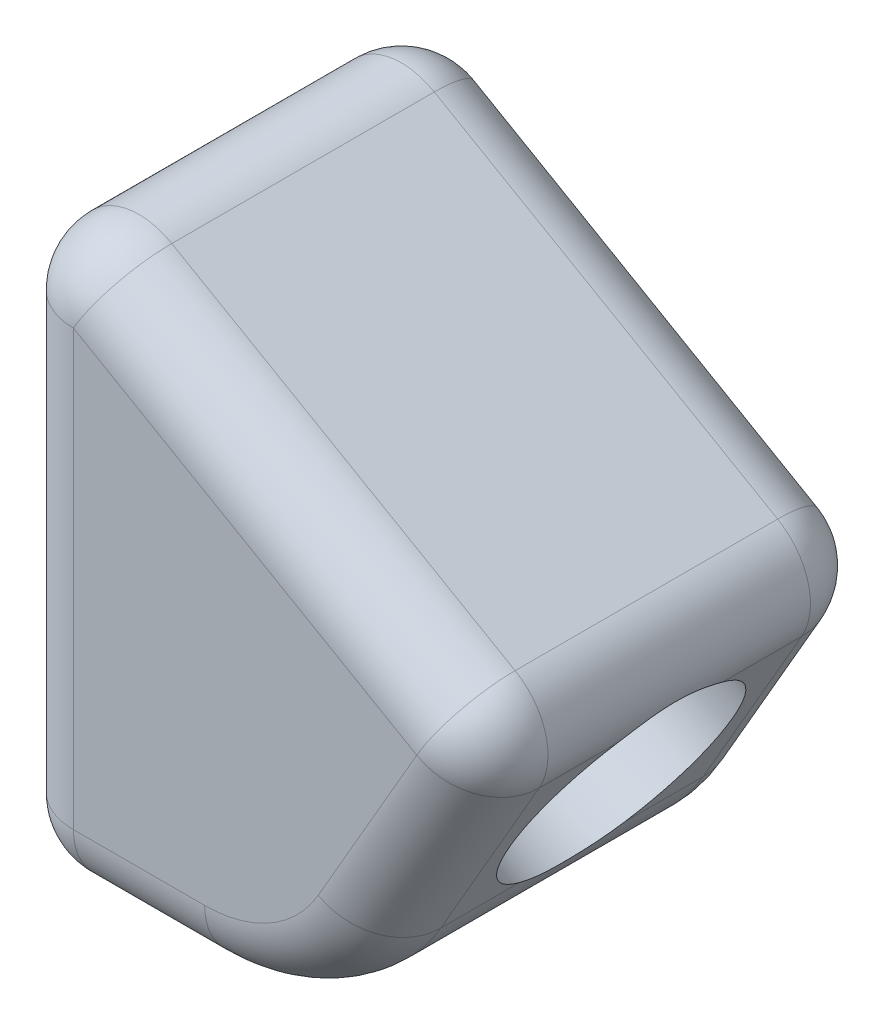
ISO-10303-21;
HEADER;
FILE_DESCRIPTION(('STEP AP214'),'2;1');
FILE_NAME('part.step','',(''),(''),'','','');
FILE_SCHEMA(('AUTOMOTIVE_DESIGN { 1 0 10303 214 1 1 1 1 }'));
ENDSEC;
DATA;
#1=APPLICATION_CONTEXT('core data for automotive mechanical design processes');
#2=APPLICATION_PROTOCOL_DEFINITION('international standard','automotive_design',2000,#1);
#3=PRODUCT_CONTEXT('',#1,'mechanical');
#4=PRODUCT('Part','Part','',(#3));
#5=PRODUCT_RELATED_PRODUCT_CATEGORY('part','',(#4));
#6=PRODUCT_DEFINITION_FORMATION('','',#4);
#7=PRODUCT_DEFINITION_CONTEXT('part definition',#1,'design');
#8=PRODUCT_DEFINITION('design','',#6,#7);
#9=PRODUCT_DEFINITION_SHAPE('','',#8);
#10=(LENGTH_UNIT() NAMED_UNIT(*) SI_UNIT(.MILLI.,.METRE.));
#11=(NAMED_UNIT(*) PLANE_ANGLE_UNIT() SI_UNIT($,.RADIAN.));
#12=(NAMED_UNIT(*) SI_UNIT($,.STERADIAN.) SOLID_ANGLE_UNIT());
#13=UNCERTAINTY_MEASURE_WITH_UNIT(LENGTH_MEASURE(1.E-05),#10,'distance_accuracy_value','');
#14=(GEOMETRIC_REPRESENTATION_CONTEXT(3) GLOBAL_UNCERTAINTY_ASSIGNED_CONTEXT((#13)) GLOBAL_UNIT_ASSIGNED_CONTEXT((#10,
#11,#12)) REPRESENTATION_CONTEXT('',''));
#15=CARTESIAN_POINT('',(0.,0.,0.));
#16=DIRECTION('',(0.,0.,1.));
#17=DIRECTION('',(1.,0.,0.));
#18=AXIS2_PLACEMENT_3D('',#15,#16,#17);
#19=CARTESIAN_POINT('',(0.,97.,2.));
#20=DIRECTION('',(0.,-1.,0.));
#21=DIRECTION('',(0.,0.,-1.));
#22=AXIS2_PLACEMENT_3D('',#19,#20,#21);
#23=PLANE('',#22);
#24=CARTESIAN_POINT('',(1.,97.,0.));
#25=DIRECTION('',(0.,-1.,0.));
#26=DIRECTION('',(0.,0.,-1.));
#27=AXIS2_PLACEMENT_3D('',#24,#25,#26);
#28=CIRCLE('',#27,1.2);
#29=CARTESIAN_POINT('',(2.,97.,0.66332495807108));
#30=VERTEX_POINT('',#29);
#31=CARTESIAN_POINT('',(0.,97.,0.663324958071079));
#32=VERTEX_POINT('',#31);
#33=EDGE_CURVE('E179',#30,#32,#28,.T.);
#34=ORIENTED_EDGE('',*,*,#33,.F.);
#35=DIRECTION('',(0.,0.,1.));
#36=VECTOR('',#35,1.);
#37=CARTESIAN_POINT('',(2.,97.,-3.));
#38=LINE('',#37,#36);
#39=CARTESIAN_POINT('',(2.,97.,2.));
#40=VERTEX_POINT('',#39);
#41=EDGE_CURVE('E41',#30,#40,#38,.T.);
#42=ORIENTED_EDGE('',*,*,#41,.T.);
#43=DIRECTION('',(1.,0.,0.));
#44=VECTOR('',#43,1.);
#45=CARTESIAN_POINT('',(-0.999999999999999,97.,2.));
#46=LINE('',#45,#44);
#47=CARTESIAN_POINT('',(0.,97.,2.));
#48=VERTEX_POINT('',#47);
#49=EDGE_CURVE('E253',#40,#48,#46,.F.);
#50=ORIENTED_EDGE('',*,*,#49,.T.);
#51=DIRECTION('',(0.,0.,1.));
#52=VECTOR('',#51,1.);
#53=CARTESIAN_POINT('',(0.,97.,-3.));
#54=LINE('',#53,#52);
#55=EDGE_CURVE('E255',#48,#32,#54,.F.);
#56=ORIENTED_EDGE('',*,*,#55,.T.);
#57=EDGE_LOOP('',(#34,#42,#50,#56));
#58=FACE_BOUND('',#57,.T.);
#59=ADVANCED_FACE('F37',(#58),#23,.T.);
#60=CARTESIAN_POINT('',(6.09807621135332,101.098076211353,0.));
#61=DIRECTION('',(0.86602540378444,-0.499999999999997,0.));
#62=DIRECTION('',(0.499999999999997,0.86602540378444,0.));
#63=AXIS2_PLACEMENT_3D('',#60,#61,#62);
#64=PLANE('',#63);
#65=CARTESIAN_POINT('',(5.3480762113533,99.7990381056767,0.));
#66=DIRECTION('',(0.86602540378444,-0.499999999999997,0.));
#67=DIRECTION('',(0.499999999999997,0.86602540378444,0.));
#68=AXIS2_PLACEMENT_3D('',#65,#66,#67);
#69=CIRCLE('',#68,1.7);
#70=CARTESIAN_POINT('',(6.09807621135328,101.098076211353,0.800000000000058));
#71=VERTEX_POINT('',#70);
#72=CARTESIAN_POINT('',(4.59807621135332,98.5,0.799999999999932));
#73=VERTEX_POINT('',#72);
#74=EDGE_CURVE('E364',#71,#73,#69,.T.);
#75=ORIENTED_EDGE('',*,*,#74,.F.);
#76=DIRECTION('',(0.,0.,1.));
#77=VECTOR('',#76,1.);
#78=CARTESIAN_POINT('',(6.09807621135332,101.098076211353,-3.));
#79=LINE('',#78,#77);
#80=CARTESIAN_POINT('',(6.09807621135332,101.098076211353,2.));
#81=VERTEX_POINT('',#80);
#82=EDGE_CURVE('E238',#71,#81,#79,.T.);
#83=ORIENTED_EDGE('',*,*,#82,.T.);
#84=DIRECTION('',(0.499999999999997,0.86602540378444,0.));
#85=VECTOR('',#84,1.);
#86=CARTESIAN_POINT('',(4.59807621135332,98.5,2.));
#87=LINE('',#86,#85);
#88=CARTESIAN_POINT('',(4.59807621135332,98.5,2.));
#89=VERTEX_POINT('',#88);
#90=EDGE_CURVE('E229',#81,#89,#87,.F.);
#91=ORIENTED_EDGE('',*,*,#90,.T.);
#92=DIRECTION('',(0.,0.,1.));
#93=VECTOR('',#92,1.);
#94=CARTESIAN_POINT('',(4.59807621135332,98.5,-3.));
#95=LINE('',#94,#93);
#96=EDGE_CURVE('E219',#73,#89,#95,.T.);
#97=ORIENTED_EDGE('',*,*,#96,.F.);
#98=EDGE_LOOP('',(#75,#83,#91,#97));
#99=FACE_BOUND('',#98,.T.);
#100=ADVANCED_FACE('F496',(#99),#64,.T.);
#101=CARTESIAN_POINT('',(0.,97.,-0.663324958071079));
#102=VERTEX_POINT('',#101);
#103=CARTESIAN_POINT('',(2.,97.,-0.66332495807108));
#104=VERTEX_POINT('',#103);
#105=EDGE_CURVE('E55',#102,#104,#28,.T.);
#106=ORIENTED_EDGE('',*,*,#105,.F.);
#107=CARTESIAN_POINT('',(0.,97.,-2.));
#108=VERTEX_POINT('',#107);
#109=EDGE_CURVE('E258',#102,#108,#54,.F.);
#110=ORIENTED_EDGE('',*,*,#109,.T.);
#111=DIRECTION('',(1.,0.,0.));
#112=VECTOR('',#111,1.);
#113=CARTESIAN_POINT('',(0.,97.,-2.));
#114=LINE('',#113,#112);
#115=CARTESIAN_POINT('',(2.,97.,-2.));
#116=VERTEX_POINT('',#115);
#117=EDGE_CURVE('E259',#108,#116,#114,.T.);
#118=ORIENTED_EDGE('',*,*,#117,.T.);
#119=EDGE_CURVE('E195',#116,#104,#38,.T.);
#120=ORIENTED_EDGE('',*,*,#119,.T.);
#121=EDGE_LOOP('',(#106,#110,#118,#120));
#122=FACE_BOUND('',#121,.T.);
#123=ADVANCED_FACE('F388',(#122),#23,.T.);
#124=CARTESIAN_POINT('',(4.59807621135328,98.5,-0.799999999999932));
#125=VERTEX_POINT('',#124);
#126=CARTESIAN_POINT('',(6.09807621135328,101.098076211353,-0.800000000000058));
#127=VERTEX_POINT('',#126);
#128=EDGE_CURVE('E361',#125,#127,#69,.T.);
#129=ORIENTED_EDGE('',*,*,#128,.F.);
#130=CARTESIAN_POINT('',(4.59807621135332,98.5,-2.));
#131=VERTEX_POINT('',#130);
#132=EDGE_CURVE('E226',#131,#125,#95,.T.);
#133=ORIENTED_EDGE('',*,*,#132,.F.);
#134=DIRECTION('',(0.499999999999997,0.86602540378444,0.));
#135=VECTOR('',#134,1.);
#136=CARTESIAN_POINT('',(6.09807621135332,101.098076211353,-2.));
#137=LINE('',#136,#135);
#138=CARTESIAN_POINT('',(6.09807621135332,101.098076211353,-2.));
#139=VERTEX_POINT('',#138);
#140=EDGE_CURVE('E239',#131,#139,#137,.T.);
#141=ORIENTED_EDGE('',*,*,#140,.T.);
#142=EDGE_CURVE('E235',#139,#127,#79,.T.);
#143=ORIENTED_EDGE('',*,*,#142,.T.);
#144=EDGE_LOOP('',(#129,#133,#141,#143));
#145=FACE_BOUND('',#144,.T.);
#146=ADVANCED_FACE('F39',(#145),#64,.T.);
#147=CARTESIAN_POINT('',(0.,104.618802153517,2.));
#148=DIRECTION('',(0.,0.,1.));
#149=DIRECTION('',(1.,0.,0.));
#150=AXIS2_PLACEMENT_3D('',#147,#148,#149);
#151=SPHERICAL_SURFACE('',#150,1.);
#152=CARTESIAN_POINT('',(0.,104.618802153517,2.));
#153=DIRECTION('',(0.,0.,1.));
#154=DIRECTION('',(1.,0.,0.));
#155=AXIS2_PLACEMENT_3D('',#152,#153,#154);
#156=CIRCLE('',#155,1.);
#157=CARTESIAN_POINT('',(-0.999999999999999,104.618802153517,2.));
#158=VERTEX_POINT('',#157);
#159=CARTESIAN_POINT('',(0.500000000000004,105.484827557301,2.));
#160=VERTEX_POINT('',#159);
#161=EDGE_CURVE('E337',#158,#160,#156,.F.);
#162=ORIENTED_EDGE('',*,*,#161,.F.);
#163=CARTESIAN_POINT('',(0.,104.618802153517,2.));
#164=DIRECTION('',(0.,1.,0.));
#165=DIRECTION('',(0.,0.,1.));
#166=AXIS2_PLACEMENT_3D('',#163,#164,#165);
#167=CIRCLE('',#166,1.);
#168=CARTESIAN_POINT('',(0.,104.618802153517,3.));
#169=VERTEX_POINT('',#168);
#170=EDGE_CURVE('E349',#158,#169,#167,.T.);
#171=ORIENTED_EDGE('',*,*,#170,.T.);
#172=CARTESIAN_POINT('',(0.,104.618802153517,2.));
#173=DIRECTION('',(-0.866025403784439,0.5,0.));
#174=DIRECTION('',(-0.5,-0.866025403784439,0.));
#175=AXIS2_PLACEMENT_3D('',#172,#173,#174);
#176=CIRCLE('',#175,1.);
#177=EDGE_CURVE('E340',#160,#169,#176,.F.);
#178=ORIENTED_EDGE('',*,*,#177,.F.);
#179=EDGE_LOOP('',(#162,#171,#178));
#180=FACE_BOUND('',#179,.T.);
#181=ADVANCED_FACE('F520',(#180),#151,.T.);
#182=CARTESIAN_POINT('',(0.,104.618802153517,-2.));
#183=DIRECTION('',(0.,0.,1.));
#184=DIRECTION('',(1.,0.,0.));
#185=AXIS2_PLACEMENT_3D('',#182,#183,#184);
#186=SPHERICAL_SURFACE('',#185,1.);
#187=CARTESIAN_POINT('',(0.,104.618802153517,-2.));
#188=DIRECTION('',(0.,1.,0.));
#189=DIRECTION('',(0.,0.,1.));
#190=AXIS2_PLACEMENT_3D('',#187,#188,#189);
#191=CIRCLE('',#190,1.);
#192=CARTESIAN_POINT('',(0.,104.618802153517,-3.));
#193=VERTEX_POINT('',#192);
#194=CARTESIAN_POINT('',(-0.999999999999999,104.618802153517,-2.));
#195=VERTEX_POINT('',#194);
#196=EDGE_CURVE('E320',#193,#195,#191,.T.);
#197=ORIENTED_EDGE('',*,*,#196,.T.);
#198=CARTESIAN_POINT('',(0.,104.618802153517,-2.));
#199=DIRECTION('',(0.,0.,-1.));
#200=DIRECTION('',(-1.,0.,0.));
#201=AXIS2_PLACEMENT_3D('',#198,#199,#200);
#202=CIRCLE('',#201,1.);
#203=CARTESIAN_POINT('',(0.500000000000004,105.484827557301,-2.));
#204=VERTEX_POINT('',#203);
#205=EDGE_CURVE('E323',#195,#204,#202,.T.);
#206=ORIENTED_EDGE('',*,*,#205,.T.);
#207=CARTESIAN_POINT('',(0.,104.618802153517,-2.));
#208=DIRECTION('',(-0.866025403784439,0.499999999999999,0.));
#209=DIRECTION('',(-0.499999999999999,-0.866025403784439,0.));
#210=AXIS2_PLACEMENT_3D('',#207,#208,#209);
#211=CIRCLE('',#210,1.);
#212=EDGE_CURVE('E312',#193,#204,#211,.F.);
#213=ORIENTED_EDGE('',*,*,#212,.F.);
#214=EDGE_LOOP('',(#197,#206,#213));
#215=FACE_BOUND('',#214,.T.);
#216=ADVANCED_FACE('F458',(#215),#186,.T.);
#217=CARTESIAN_POINT('',(0.,104.618802153517,-3.));
#218=DIRECTION('',(0.,0.,1.));
#219=DIRECTION('',(1.,0.,0.));
#220=AXIS2_PLACEMENT_3D('',#217,#218,#219);
#221=CYLINDRICAL_SURFACE('',#220,1.);
#222=ORIENTED_EDGE('',*,*,#161,.T.);
#223=DIRECTION('',(0.,0.,1.));
#224=VECTOR('',#223,1.);
#225=CARTESIAN_POINT('',(0.500000000000004,105.484827557301,-3.));
#226=LINE('',#225,#224);
#227=EDGE_CURVE('E270',#204,#160,#226,.T.);
#228=ORIENTED_EDGE('',*,*,#227,.F.);
#229=ORIENTED_EDGE('',*,*,#205,.F.);
#230=DIRECTION('',(0.,0.,1.));
#231=VECTOR('',#230,1.);
#232=CARTESIAN_POINT('',(-0.999999999999999,104.618802153517,-3.));
#233=LINE('',#232,#231);
#234=EDGE_CURVE('E281',#158,#195,#233,.F.);
#235=ORIENTED_EDGE('',*,*,#234,.F.);
#236=EDGE_LOOP('',(#222,#228,#229,#235));
#237=FACE_BOUND('',#236,.T.);
#238=ADVANCED_FACE('F456',(#237),#221,.T.);
#239=CARTESIAN_POINT('',(0.,100.,2.));
#240=DIRECTION('',(0.,1.,0.));
#241=DIRECTION('',(0.,0.,1.));
#242=AXIS2_PLACEMENT_3D('',#239,#240,#241);
#243=CYLINDRICAL_SURFACE('',#242,1.);
#244=CARTESIAN_POINT('',(0.,98.,2.));
#245=DIRECTION('',(0.,-1.,0.));
#246=DIRECTION('',(0.,0.,-1.));
#247=AXIS2_PLACEMENT_3D('',#244,#245,#246);
#248=CIRCLE('',#247,1.);
#249=CARTESIAN_POINT('',(0.,98.,3.));
#250=VERTEX_POINT('',#249);
#251=CARTESIAN_POINT('',(-0.999999999999999,98.,2.));
#252=VERTEX_POINT('',#251);
#253=EDGE_CURVE('E358',#250,#252,#248,.T.);
#254=ORIENTED_EDGE('',*,*,#253,.F.);
#255=DIRECTION('',(0.,-1.,0.));
#256=VECTOR('',#255,1.);
#257=CARTESIAN_POINT('',(0.,97.,3.));
#258=LINE('',#257,#256);
#259=EDGE_CURVE('E292',#169,#250,#258,.T.);
#260=ORIENTED_EDGE('',*,*,#259,.F.);
#261=ORIENTED_EDGE('',*,*,#170,.F.);
#262=DIRECTION('',(0.,-1.,0.));
#263=VECTOR('',#262,1.);
#264=CARTESIAN_POINT('',(-0.999999999999999,106.350852961086,2.));
#265=LINE('',#264,#263);
#266=EDGE_CURVE('E277',#252,#158,#265,.F.);
#267=ORIENTED_EDGE('',*,*,#266,.F.);
#268=EDGE_LOOP('',(#254,#260,#261,#267));
#269=FACE_BOUND('',#268,.T.);
#270=ADVANCED_FACE('F517',(#269),#243,.T.);
#271=CARTESIAN_POINT('',(0.,97.,-2.));
#272=DIRECTION('',(0.,-1.,0.));
#273=DIRECTION('',(0.,0.,-1.));
#274=AXIS2_PLACEMENT_3D('',#271,#272,#273);
#275=CYLINDRICAL_SURFACE('',#274,1.);
#276=CARTESIAN_POINT('',(0.,98.,-2.));
#277=DIRECTION('',(0.,-1.,0.));
#278=DIRECTION('',(0.,0.,-1.));
#279=AXIS2_PLACEMENT_3D('',#276,#277,#278);
#280=CIRCLE('',#279,1.);
#281=CARTESIAN_POINT('',(-0.999999999999999,98.,-2.));
#282=VERTEX_POINT('',#281);
#283=CARTESIAN_POINT('',(0.,98.,-3.));
#284=VERTEX_POINT('',#283);
#285=EDGE_CURVE('E334',#282,#284,#280,.T.);
#286=ORIENTED_EDGE('',*,*,#285,.F.);
#287=DIRECTION('',(0.,-1.,0.));
#288=VECTOR('',#287,1.);
#289=CARTESIAN_POINT('',(-0.999999999999999,97.,-2.));
#290=LINE('',#289,#288);
#291=EDGE_CURVE('E283',#195,#282,#290,.T.);
#292=ORIENTED_EDGE('',*,*,#291,.F.);
#293=ORIENTED_EDGE('',*,*,#196,.F.);
#294=DIRECTION('',(0.,-1.,0.));
#295=VECTOR('',#294,1.);
#296=CARTESIAN_POINT('',(0.,100.,-3.));
#297=LINE('',#296,#295);
#298=EDGE_CURVE('E242',#284,#193,#297,.F.);
#299=ORIENTED_EDGE('',*,*,#298,.F.);
#300=EDGE_LOOP('',(#286,#292,#293,#299));
#301=FACE_BOUND('',#300,.T.);
#302=ADVANCED_FACE('F451',(#301),#275,.T.);
#303=CARTESIAN_POINT('',(3.50000000000001,102.598076211353,2.));
#304=DIRECTION('',(0.866025403784438,-0.500000000000001,0.));
#305=DIRECTION('',(0.500000000000001,0.866025403784438,0.));
#306=AXIS2_PLACEMENT_3D('',#303,#304,#305);
#307=CYLINDRICAL_SURFACE('',#306,1.);
#308=ORIENTED_EDGE('',*,*,#177,.T.);
#309=DIRECTION('',(-0.866025403784438,0.500000000000001,0.));
#310=VECTOR('',#309,1.);
#311=CARTESIAN_POINT('',(-1.5,105.484827557301,3.));
#312=LINE('',#311,#310);
#313=CARTESIAN_POINT('',(5.23205080756888,101.598076211353,3.));
#314=VERTEX_POINT('',#313);
#315=EDGE_CURVE('E290',#314,#169,#312,.T.);
#316=ORIENTED_EDGE('',*,*,#315,.F.);
#317=CARTESIAN_POINT('',(5.23205080756888,101.598076211353,2.));
#318=DIRECTION('',(0.86602540378444,-0.499999999999999,0.));
#319=DIRECTION('',(0.499999999999999,0.866025403784439,0.));
#320=AXIS2_PLACEMENT_3D('',#317,#318,#319);
#321=CIRCLE('',#320,1.);
#322=CARTESIAN_POINT('',(5.73205080756888,102.464101615138,2.));
#323=VERTEX_POINT('',#322);
#324=EDGE_CURVE('E326',#323,#314,#321,.T.);
#325=ORIENTED_EDGE('',*,*,#324,.F.);
#326=DIRECTION('',(-0.866025403784438,0.500000000000001,0.));
#327=VECTOR('',#326,1.);
#328=CARTESIAN_POINT('',(6.59807621135332,101.964101615138,2.));
#329=LINE('',#328,#327);
#330=EDGE_CURVE('E268',#160,#323,#329,.F.);
#331=ORIENTED_EDGE('',*,*,#330,.F.);
#332=EDGE_LOOP('',(#308,#316,#325,#331));
#333=FACE_BOUND('',#332,.T.);
#334=ADVANCED_FACE('F510',(#333),#307,.T.);
#335=CARTESIAN_POINT('',(6.09807621135332,101.098076211353,-2.));
#336=DIRECTION('',(-0.866025403784438,0.500000000000001,0.));
#337=DIRECTION('',(-0.500000000000001,-0.866025403784438,0.));
#338=AXIS2_PLACEMENT_3D('',#335,#336,#337);
#339=CYLINDRICAL_SURFACE('',#338,1.);
#340=ORIENTED_EDGE('',*,*,#212,.T.);
#341=DIRECTION('',(-0.866025403784438,0.500000000000001,0.));
#342=VECTOR('',#341,1.);
#343=CARTESIAN_POINT('',(6.59807621135332,101.964101615138,-2.));
#344=LINE('',#343,#342);
#345=CARTESIAN_POINT('',(5.73205080756888,102.464101615138,-2.));
#346=VERTEX_POINT('',#345);
#347=EDGE_CURVE('E274',#346,#204,#344,.T.);
#348=ORIENTED_EDGE('',*,*,#347,.F.);
#349=CARTESIAN_POINT('',(5.23205080756888,101.598076211353,-2.));
#350=DIRECTION('',(0.866025403784438,-0.500000000000002,0.));
#351=DIRECTION('',(0.500000000000002,0.866025403784438,0.));
#352=AXIS2_PLACEMENT_3D('',#349,#350,#351);
#353=CIRCLE('',#352,1.);
#354=CARTESIAN_POINT('',(5.23205080756888,101.598076211353,-3.));
#355=VERTEX_POINT('',#354);
#356=EDGE_CURVE('E303',#355,#346,#353,.T.);
#357=ORIENTED_EDGE('',*,*,#356,.F.);
#358=DIRECTION('',(-0.866025403784438,0.500000000000001,0.));
#359=VECTOR('',#358,1.);
#360=CARTESIAN_POINT('',(3.50000000000001,102.598076211353,-3.));
#361=LINE('',#360,#359);
#362=EDGE_CURVE('E244',#193,#355,#361,.F.);
#363=ORIENTED_EDGE('',*,*,#362,.F.);
#364=EDGE_LOOP('',(#340,#348,#357,#363));
#365=FACE_BOUND('',#364,.T.);
#366=ADVANCED_FACE('F463',(#365),#339,.T.);
#367=CARTESIAN_POINT('',(2.,100.,3.));
#368=DIRECTION('',(0.,0.,-1.));
#369=DIRECTION('',(-1.,0.,0.));
#370=AXIS2_PLACEMENT_3D('',#367,#368,#369);
#371=PLANE('',#370);
#372=ORIENTED_EDGE('',*,*,#259,.T.);
#373=DIRECTION('',(1.,0.,0.));
#374=VECTOR('',#373,1.);
#375=CARTESIAN_POINT('',(2.,98.,3.));
#376=LINE('',#375,#374);
#377=CARTESIAN_POINT('',(2.,98.,3.));
#378=VERTEX_POINT('',#377);
#379=EDGE_CURVE('E294',#250,#378,#376,.T.);
#380=ORIENTED_EDGE('',*,*,#379,.T.);
#381=CARTESIAN_POINT('',(2.,100.,3.));
#382=DIRECTION('',(0.,0.,-1.));
#383=DIRECTION('',(-1.,0.,0.));
#384=AXIS2_PLACEMENT_3D('',#381,#382,#383);
#385=CIRCLE('',#384,2.);
#386=CARTESIAN_POINT('',(3.73205080756888,99.,3.));
#387=VERTEX_POINT('',#386);
#388=EDGE_CURVE('E286',#378,#387,#385,.F.);
#389=ORIENTED_EDGE('',*,*,#388,.T.);
#390=DIRECTION('',(0.499999999999997,0.86602540378444,0.));
#391=VECTOR('',#390,1.);
#392=CARTESIAN_POINT('',(5.73205080756888,102.464101615138,3.));
#393=LINE('',#392,#391);
#394=EDGE_CURVE('E288',#387,#314,#393,.T.);
#395=ORIENTED_EDGE('',*,*,#394,.T.);
#396=ORIENTED_EDGE('',*,*,#315,.T.);
#397=EDGE_LOOP('',(#372,#380,#389,#395,#396));
#398=FACE_BOUND('',#397,.T.);
#399=ADVANCED_FACE('F514',(#398),#371,.F.);
#400=CARTESIAN_POINT('',(5.23205080756888,101.598076211353,2.));
#401=DIRECTION('',(0.,0.,1.));
#402=DIRECTION('',(1.,0.,0.));
#403=AXIS2_PLACEMENT_3D('',#400,#401,#402);
#404=SPHERICAL_SURFACE('',#403,1.);
#405=ORIENTED_EDGE('',*,*,#324,.T.);
#406=CARTESIAN_POINT('',(5.23205080756888,101.598076211353,2.));
#407=DIRECTION('',(0.5,0.866025403784439,0.));
#408=DIRECTION('',(-0.866025403784439,0.5,0.));
#409=AXIS2_PLACEMENT_3D('',#406,#407,#408);
#410=CIRCLE('',#409,1.);
#411=EDGE_CURVE('E329',#314,#81,#410,.T.);
#412=ORIENTED_EDGE('',*,*,#411,.T.);
#413=CARTESIAN_POINT('',(5.23205080756888,101.598076211353,2.));
#414=DIRECTION('',(0.,0.,1.));
#415=DIRECTION('',(1.,0.,0.));
#416=AXIS2_PLACEMENT_3D('',#413,#414,#415);
#417=CIRCLE('',#416,1.);
#418=EDGE_CURVE('E314',#323,#81,#417,.F.);
#419=ORIENTED_EDGE('',*,*,#418,.F.);
#420=EDGE_LOOP('',(#405,#412,#419));
#421=FACE_BOUND('',#420,.T.);
#422=ADVANCED_FACE('F505',(#421),#404,.T.);
#423=CARTESIAN_POINT('',(6.59807621135332,101.964101615138,-3.));
#424=DIRECTION('',(0.500000000000001,0.866025403784438,0.));
#425=DIRECTION('',(-0.866025403784438,0.500000000000001,0.));
#426=AXIS2_PLACEMENT_3D('',#423,#424,#425);
#427=PLANE('',#426);
#428=DIRECTION('',(0.,0.,1.));
#429=VECTOR('',#428,1.);
#430=CARTESIAN_POINT('',(5.73205080756888,102.464101615138,-3.));
#431=LINE('',#430,#429);
#432=EDGE_CURVE('E272',#323,#346,#431,.F.);
#433=ORIENTED_EDGE('',*,*,#432,.T.);
#434=ORIENTED_EDGE('',*,*,#347,.T.);
#435=ORIENTED_EDGE('',*,*,#227,.T.);
#436=ORIENTED_EDGE('',*,*,#330,.T.);
#437=EDGE_LOOP('',(#433,#434,#435,#436));
#438=FACE_BOUND('',#437,.T.);
#439=ADVANCED_FACE('F210',(#438),#427,.T.);
#440=CARTESIAN_POINT('',(5.23205080756888,101.598076211353,-2.));
#441=DIRECTION('',(0.,0.,1.));
#442=DIRECTION('',(1.,0.,0.));
#443=AXIS2_PLACEMENT_3D('',#440,#441,#442);
#444=SPHERICAL_SURFACE('',#443,1.);
#445=ORIENTED_EDGE('',*,*,#356,.T.);
#446=CARTESIAN_POINT('',(5.23205080756888,101.598076211353,-2.));
#447=DIRECTION('',(0.,0.,-1.));
#448=DIRECTION('',(-1.,0.,0.));
#449=AXIS2_PLACEMENT_3D('',#446,#447,#448);
#450=CIRCLE('',#449,1.);
#451=EDGE_CURVE('E306',#346,#139,#450,.T.);
#452=ORIENTED_EDGE('',*,*,#451,.T.);
#453=CARTESIAN_POINT('',(5.23205080756888,101.598076211353,-2.));
#454=DIRECTION('',(0.5,0.866025403784439,0.));
#455=DIRECTION('',(-0.866025403784439,0.5,0.));
#456=AXIS2_PLACEMENT_3D('',#453,#454,#455);
#457=CIRCLE('',#456,1.);
#458=EDGE_CURVE('E298',#355,#139,#457,.F.);
#459=ORIENTED_EDGE('',*,*,#458,.F.);
#460=EDGE_LOOP('',(#445,#452,#459));
#461=FACE_BOUND('',#460,.T.);
#462=ADVANCED_FACE('F659',(#461),#444,.T.);
#463=CARTESIAN_POINT('',(2.,100.,-3.));
#464=DIRECTION('',(0.,0.,-1.));
#465=DIRECTION('',(-1.,0.,0.));
#466=AXIS2_PLACEMENT_3D('',#463,#464,#465);
#467=PLANE('',#466);
#468=DIRECTION('',(0.499999999999997,0.86602540378444,0.));
#469=VECTOR('',#468,1.);
#470=CARTESIAN_POINT('',(3.73205080756888,99.,-3.));
#471=LINE('',#470,#469);
#472=CARTESIAN_POINT('',(3.73205080756888,99.,-3.));
#473=VERTEX_POINT('',#472);
#474=EDGE_CURVE('E248',#355,#473,#471,.F.);
#475=ORIENTED_EDGE('',*,*,#474,.T.);
#476=CARTESIAN_POINT('',(2.,100.,-3.));
#477=DIRECTION('',(0.,0.,-1.));
#478=DIRECTION('',(-1.,0.,0.));
#479=AXIS2_PLACEMENT_3D('',#476,#477,#478);
#480=CIRCLE('',#479,2.);
#481=CARTESIAN_POINT('',(2.,98.,-3.));
#482=VERTEX_POINT('',#481);
#483=EDGE_CURVE('E251',#473,#482,#480,.T.);
#484=ORIENTED_EDGE('',*,*,#483,.T.);
#485=DIRECTION('',(1.,0.,0.));
#486=VECTOR('',#485,1.);
#487=CARTESIAN_POINT('',(2.,98.,-3.));
#488=LINE('',#487,#486);
#489=EDGE_CURVE('E246',#482,#284,#488,.F.);
#490=ORIENTED_EDGE('',*,*,#489,.T.);
#491=ORIENTED_EDGE('',*,*,#298,.T.);
#492=ORIENTED_EDGE('',*,*,#362,.T.);
#493=EDGE_LOOP('',(#475,#484,#490,#491,#492));
#494=FACE_BOUND('',#493,.T.);
#495=ADVANCED_FACE('F466',(#494),#467,.T.);
#496=CARTESIAN_POINT('',(2.,100.,-2.));
#497=DIRECTION('',(0.,0.,-1.));
#498=DIRECTION('',(-1.,0.,0.));
#499=AXIS2_PLACEMENT_3D('',#496,#497,#498);
#500=TOROIDAL_SURFACE('',#499,2.,1.);
#501=CARTESIAN_POINT('',(2.,98.,-2.));
#502=DIRECTION('',(1.,0.,0.));
#503=DIRECTION('',(0.,0.,-1.));
#504=AXIS2_PLACEMENT_3D('',#501,#502,#503);
#505=CIRCLE('',#504,1.);
#506=EDGE_CURVE('E309',#116,#482,#505,.T.);
#507=ORIENTED_EDGE('',*,*,#506,.T.);
#508=ORIENTED_EDGE('',*,*,#483,.F.);
#509=CARTESIAN_POINT('',(3.73205080756888,99.,-2.));
#510=DIRECTION('',(0.5,0.866025403784438,0.));
#511=DIRECTION('',(-0.866025403784438,0.5,0.));
#512=AXIS2_PLACEMENT_3D('',#509,#510,#511);
#513=CIRCLE('',#512,1.);
#514=EDGE_CURVE('E301',#131,#473,#513,.T.);
#515=ORIENTED_EDGE('',*,*,#514,.F.);
#516=CARTESIAN_POINT('',(2.,100.,-2.));
#517=DIRECTION('',(0.,0.,-1.));
#518=DIRECTION('',(-1.,0.,0.));
#519=AXIS2_PLACEMENT_3D('',#516,#517,#518);
#520=CIRCLE('',#519,3.);
#521=EDGE_CURVE('E265',#116,#131,#520,.F.);
#522=ORIENTED_EDGE('',*,*,#521,.F.);
#523=EDGE_LOOP('',(#507,#508,#515,#522));
#524=FACE_BOUND('',#523,.T.);
#525=ADVANCED_FACE('F481',(#524),#500,.T.);
#526=CARTESIAN_POINT('',(5.23205080756888,101.598076211353,-2.));
#527=DIRECTION('',(0.499999999999997,0.86602540378444,0.));
#528=DIRECTION('',(-0.86602540378444,0.499999999999997,0.));
#529=AXIS2_PLACEMENT_3D('',#526,#527,#528);
#530=CYLINDRICAL_SURFACE('',#529,1.);
#531=ORIENTED_EDGE('',*,*,#514,.T.);
#532=ORIENTED_EDGE('',*,*,#474,.F.);
#533=ORIENTED_EDGE('',*,*,#458,.T.);
#534=ORIENTED_EDGE('',*,*,#140,.F.);
#535=EDGE_LOOP('',(#531,#532,#533,#534));
#536=FACE_BOUND('',#535,.T.);
#537=ADVANCED_FACE('F208',(#536),#530,.T.);
#538=CARTESIAN_POINT('',(5.23205080756888,101.598076211353,-3.));
#539=DIRECTION('',(0.,0.,1.));
#540=DIRECTION('',(1.,0.,0.));
#541=AXIS2_PLACEMENT_3D('',#538,#539,#540);
#542=CYLINDRICAL_SURFACE('',#541,1.);
#543=CARTESIAN_POINT('',(6.09807621135332,101.098076211353,-0.800000000000055));
#544=CARTESIAN_POINT('',(6.10803078805828,101.115338683814,-0.762643212308241));
#545=CARTESIAN_POINT('',(6.1167845318648,101.131671693267,-0.72454782677543));
#546=CARTESIAN_POINT('',(6.13221586045606,101.162185681627,-0.647106874380023));
#547=CARTESIAN_POINT('',(6.13889402379648,101.176367259668,-0.607761659276473));
#548=CARTESIAN_POINT('',(6.15050078384016,101.20228607231,-0.528055153701777));
#549=CARTESIAN_POINT('',(6.15543061377418,101.214025027453,-0.487694601031757));
#550=CARTESIAN_POINT('',(6.16381690807346,101.234843202211,-0.406138383714845));
#551=CARTESIAN_POINT('',(6.1672731911047,101.243922094439,-0.364942616939947));
#552=CARTESIAN_POINT('',(6.17326846488547,101.260150950659,-0.276951640930825));
#553=CARTESIAN_POINT('',(6.17564747898442,101.266938398907,-0.230078039616492));
#554=CARTESIAN_POINT('',(6.17903679483942,101.276759265848,-0.135868874319984));
#555=CARTESIAN_POINT('',(6.18004647398402,101.279790976823,-0.088533110046155));
#556=CARTESIAN_POINT('',(6.18078934368853,101.282011885316,0.00625314012193648));
#557=CARTESIAN_POINT('',(6.18052215968274,101.28119995531,0.0537036555977651));
#558=CARTESIAN_POINT('',(6.17868537465104,101.275754879999,0.148338284457708));
#559=CARTESIAN_POINT('',(6.17711632187487,101.271123343232,0.195522501566904));
#560=CARTESIAN_POINT('',(6.17245110603144,101.257931825397,0.291008479956032));
#561=CARTESIAN_POINT('',(6.16930171190307,101.249235689207,0.339288854787462));
#562=CARTESIAN_POINT('',(6.16116944878587,101.228122798393,0.434872197645592));
#563=CARTESIAN_POINT('',(6.15618649567663,101.215705873071,0.482175120723376));
#564=CARTESIAN_POINT('',(6.14398776754598,101.187453963733,0.575558229013717));
#565=CARTESIAN_POINT('',(6.13676768745757,101.171612407372,0.621635869074494));
#566=CARTESIAN_POINT('',(6.11959604660907,101.136961004659,0.712141519615453));
#567=CARTESIAN_POINT('',(6.10964410961385,101.118150749606,0.75656930191744));
#568=CARTESIAN_POINT('',(6.09807621135332,101.098076211353,0.800000000000056));
#569=B_SPLINE_CURVE_WITH_KNOTS('',3,(#543,#544,#545,#546,#547,#548,#549,#550,#551,#552,#553,
#554,#555,#556,#557,#558,#559,#560,#561,#562,#563,#564,#565,#566,#567,#568),.UNSPECIFIED.,.F.,
.F.,(4,2,2,2,2,2,2,2,2,2,2,2,4),(0.,0.126971192502358,0.253906960733841,0.380753012716916,
0.507614669815478,0.649709245593381,0.791868407528076,0.934069274175821,1.07621028683188,
1.22349738921128,1.37079124970245,1.51837033767408,1.66596976064836),.UNSPECIFIED.);
#570=EDGE_CURVE('E297',#127,#71,#569,.T.);
#571=ORIENTED_EDGE('',*,*,#570,.F.);
#572=ORIENTED_EDGE('',*,*,#142,.F.);
#573=ORIENTED_EDGE('',*,*,#451,.F.);
#574=ORIENTED_EDGE('',*,*,#432,.F.);
#575=ORIENTED_EDGE('',*,*,#418,.T.);
#576=ORIENTED_EDGE('',*,*,#82,.F.);
#577=EDGE_LOOP('',(#571,#572,#573,#574,#575,#576));
#578=FACE_BOUND('',#577,.T.);
#579=ADVANCED_FACE('F379',(#578),#542,.T.);
#580=CARTESIAN_POINT('',(0.,98.,-2.));
#581=DIRECTION('',(0.,0.,1.));
#582=DIRECTION('',(1.,0.,0.));
#583=AXIS2_PLACEMENT_3D('',#580,#581,#582);
#584=SPHERICAL_SURFACE('',#583,1.);
#585=CARTESIAN_POINT('',(0.,98.,-2.));
#586=DIRECTION('',(0.,0.,-1.));
#587=DIRECTION('',(-1.,0.,0.));
#588=AXIS2_PLACEMENT_3D('',#585,#586,#587);
#589=CIRCLE('',#588,1.);
#590=EDGE_CURVE('E332',#108,#282,#589,.T.);
#591=ORIENTED_EDGE('',*,*,#590,.T.);
#592=ORIENTED_EDGE('',*,*,#285,.T.);
#593=CARTESIAN_POINT('',(0.,98.,-2.));
#594=DIRECTION('',(-1.,0.,0.));
#595=DIRECTION('',(0.,0.,1.));
#596=AXIS2_PLACEMENT_3D('',#593,#594,#595);
#597=CIRCLE('',#596,1.);
#598=EDGE_CURVE('E317',#108,#284,#597,.F.);
#599=ORIENTED_EDGE('',*,*,#598,.F.);
#600=EDGE_LOOP('',(#591,#592,#599));
#601=FACE_BOUND('',#600,.T.);
#602=ADVANCED_FACE('F469',(#601),#584,.T.);
#603=CARTESIAN_POINT('',(0.,98.,-2.));
#604=DIRECTION('',(1.,0.,0.));
#605=DIRECTION('',(0.,0.,-1.));
#606=AXIS2_PLACEMENT_3D('',#603,#604,#605);
#607=CYLINDRICAL_SURFACE('',#606,1.);
#608=ORIENTED_EDGE('',*,*,#598,.T.);
#609=ORIENTED_EDGE('',*,*,#489,.F.);
#610=ORIENTED_EDGE('',*,*,#506,.F.);
#611=ORIENTED_EDGE('',*,*,#117,.F.);
#612=EDGE_LOOP('',(#608,#609,#610,#611));
#613=FACE_BOUND('',#612,.T.);
#614=ADVANCED_FACE('F472',(#613),#607,.T.);
#615=CARTESIAN_POINT('',(2.,100.,2.));
#616=DIRECTION('',(0.,0.,-1.));
#617=DIRECTION('',(-1.,0.,0.));
#618=AXIS2_PLACEMENT_3D('',#615,#616,#617);
#619=TOROIDAL_SURFACE('',#618,2.,1.);
#620=CARTESIAN_POINT('',(2.,98.,2.));
#621=DIRECTION('',(1.,0.,0.));
#622=DIRECTION('',(0.,0.,-1.));
#623=AXIS2_PLACEMENT_3D('',#620,#621,#622);
#624=CIRCLE('',#623,1.);
#625=EDGE_CURVE('E352',#378,#40,#624,.T.);
#626=ORIENTED_EDGE('',*,*,#625,.T.);
#627=CARTESIAN_POINT('',(2.,100.,2.));
#628=DIRECTION('',(0.,0.,-1.));
#629=DIRECTION('',(-1.,0.,0.));
#630=AXIS2_PLACEMENT_3D('',#627,#628,#629);
#631=CIRCLE('',#630,3.);
#632=EDGE_CURVE('E262',#89,#40,#631,.T.);
#633=ORIENTED_EDGE('',*,*,#632,.F.);
#634=CARTESIAN_POINT('',(3.73205080756888,99.,2.));
#635=DIRECTION('',(0.5,0.866025403784438,0.));
#636=DIRECTION('',(-0.866025403784439,0.5,0.));
#637=AXIS2_PLACEMENT_3D('',#634,#635,#636);
#638=CIRCLE('',#637,1.);
#639=EDGE_CURVE('E343',#387,#89,#638,.T.);
#640=ORIENTED_EDGE('',*,*,#639,.F.);
#641=ORIENTED_EDGE('',*,*,#388,.F.);
#642=EDGE_LOOP('',(#626,#633,#640,#641));
#643=FACE_BOUND('',#642,.T.);
#644=ADVANCED_FACE('F621',(#643),#619,.T.);
#645=CARTESIAN_POINT('',(3.73205080756889,99.,2.));
#646=DIRECTION('',(-0.499999999999997,-0.86602540378444,0.));
#647=DIRECTION('',(0.86602540378444,-0.499999999999997,0.));
#648=AXIS2_PLACEMENT_3D('',#645,#646,#647);
#649=CYLINDRICAL_SURFACE('',#648,1.);
#650=ORIENTED_EDGE('',*,*,#639,.T.);
#651=ORIENTED_EDGE('',*,*,#90,.F.);
#652=ORIENTED_EDGE('',*,*,#411,.F.);
#653=ORIENTED_EDGE('',*,*,#394,.F.);
#654=EDGE_LOOP('',(#650,#651,#652,#653));
#655=FACE_BOUND('',#654,.T.);
#656=ADVANCED_FACE('F501',(#655),#649,.T.);
#657=CARTESIAN_POINT('',(-0.999999999999999,97.,-3.));
#658=DIRECTION('',(-1.,0.,0.));
#659=DIRECTION('',(0.,0.,1.));
#660=AXIS2_PLACEMENT_3D('',#657,#658,#659);
#661=PLANE('',#660);
#662=ORIENTED_EDGE('',*,*,#234,.T.);
#663=ORIENTED_EDGE('',*,*,#291,.T.);
#664=DIRECTION('',(0.,0.,1.));
#665=VECTOR('',#664,1.);
#666=CARTESIAN_POINT('',(-0.999999999999999,98.,-3.));
#667=LINE('',#666,#665);
#668=EDGE_CURVE('E279',#282,#252,#667,.T.);
#669=ORIENTED_EDGE('',*,*,#668,.T.);
#670=ORIENTED_EDGE('',*,*,#266,.T.);
#671=EDGE_LOOP('',(#662,#663,#669,#670));
#672=FACE_BOUND('',#671,.T.);
#673=ADVANCED_FACE('F445',(#672),#661,.T.);
#674=CARTESIAN_POINT('',(0.,98.,2.));
#675=DIRECTION('',(0.,0.,1.));
#676=DIRECTION('',(1.,0.,0.));
#677=AXIS2_PLACEMENT_3D('',#674,#675,#676);
#678=SPHERICAL_SURFACE('',#677,1.);
#679=CARTESIAN_POINT('',(0.,98.,2.));
#680=DIRECTION('',(-1.,0.,0.));
#681=DIRECTION('',(0.,0.,1.));
#682=AXIS2_PLACEMENT_3D('',#679,#680,#681);
#683=CIRCLE('',#682,1.);
#684=EDGE_CURVE('E355',#48,#250,#683,.T.);
#685=ORIENTED_EDGE('',*,*,#684,.T.);
#686=ORIENTED_EDGE('',*,*,#253,.T.);
#687=CARTESIAN_POINT('',(0.,98.,2.));
#688=DIRECTION('',(0.,0.,1.));
#689=DIRECTION('',(1.,0.,0.));
#690=AXIS2_PLACEMENT_3D('',#687,#688,#689);
#691=CIRCLE('',#690,1.);
#692=EDGE_CURVE('E346',#48,#252,#691,.F.);
#693=ORIENTED_EDGE('',*,*,#692,.F.);
#694=EDGE_LOOP('',(#685,#686,#693));
#695=FACE_BOUND('',#694,.T.);
#696=ADVANCED_FACE('F439',(#695),#678,.T.);
#697=CARTESIAN_POINT('',(0.,98.,-3.));
#698=DIRECTION('',(0.,0.,1.));
#699=DIRECTION('',(1.,0.,0.));
#700=AXIS2_PLACEMENT_3D('',#697,#698,#699);
#701=CYLINDRICAL_SURFACE('',#700,1.);
#702=CARTESIAN_POINT('',(0.,97.,0.663324958071079));
#703=CARTESIAN_POINT('',(-0.0185621513673386,97.000006067088,0.635347104865766));
#704=CARTESIAN_POINT('',(-0.0359392598619916,97.0005169058093,0.606595325866813));
#705=CARTESIAN_POINT('',(-0.068214779265481,97.0021969514604,0.547759810452852));
#706=CARTESIAN_POINT('',(-0.0831138624612873,97.0033659794451,0.517676438111895));
#707=CARTESIAN_POINT('',(-0.110335378152692,97.0060116577532,0.456377168655559));
#708=CARTESIAN_POINT('',(-0.122657724049196,97.0074883184122,0.425161233518324));
#709=CARTESIAN_POINT('',(-0.144646127237287,97.0104550095034,0.361816050831991));
#710=CARTESIAN_POINT('',(-0.154312066897057,97.0119450405246,0.329686762907011));
#711=CARTESIAN_POINT('',(-0.179217383994119,97.0160405571358,0.232232647890771));
#712=CARTESIAN_POINT('',(-0.190384692780798,97.0182742350813,0.165795459334388));
#713=CARTESIAN_POINT('',(-0.201449517383525,97.0204848435349,0.0320153299910096));
#714=CARTESIAN_POINT('',(-0.20135355825635,97.0204630806699,-0.0353270637795379));
#715=CARTESIAN_POINT('',(-0.189982040448427,97.0181964376261,-0.168423679810111));
#716=CARTESIAN_POINT('',(-0.178803521910785,97.01597085455,-0.234186613435958));
#717=CARTESIAN_POINT('',(-0.145733644155679,97.0105358896632,-0.362912178403204));
#718=CARTESIAN_POINT('',(-0.123846952222257,97.0073269366933,-0.425876016732469));
#719=CARTESIAN_POINT('',(-0.083277884935312,97.003380894703,-0.517344652398642));
#720=CARTESIAN_POINT('',(-0.0683345293045364,97.0022050797836,-0.547535647688191));
#721=CARTESIAN_POINT('',(-0.0359883683268994,97.0005175884639,-0.606511643055704));
#722=CARTESIAN_POINT('',(-0.0185904016196043,97.0000046251606,-0.635299262802458));
#723=CARTESIAN_POINT('',(0.,97.,-0.663324958071079));
#724=B_SPLINE_CURVE_WITH_KNOTS('',3,(#702,#703,#704,#705,#706,#707,#708,#709,#710,#711,#712,
#713,#714,#715,#716,#717,#718,#719,#720,#721,#722,#723),.UNSPECIFIED.,.F.,.F.,(4,2,2,2,2,2,2,2,
2,2,4),(0.,0.100678436174197,0.201329513628924,0.301983973225766,0.402642889317154,
0.603811072468586,0.804862715079171,1.00416933751296,1.20338916708361,1.30440219434106,
1.40521881229671),.UNSPECIFIED.);
#725=EDGE_CURVE('E365',#32,#102,#724,.T.);
#726=ORIENTED_EDGE('',*,*,#725,.F.);
#727=ORIENTED_EDGE('',*,*,#55,.F.);
#728=ORIENTED_EDGE('',*,*,#692,.T.);
#729=ORIENTED_EDGE('',*,*,#668,.F.);
#730=ORIENTED_EDGE('',*,*,#590,.F.);
#731=ORIENTED_EDGE('',*,*,#109,.F.);
#732=EDGE_LOOP('',(#726,#727,#728,#729,#730,#731));
#733=FACE_BOUND('',#732,.T.);
#734=ADVANCED_FACE('F429',(#733),#701,.T.);
#735=CARTESIAN_POINT('',(2.,98.,2.));
#736=DIRECTION('',(-1.,0.,0.));
#737=DIRECTION('',(0.,0.,1.));
#738=AXIS2_PLACEMENT_3D('',#735,#736,#737);
#739=CYLINDRICAL_SURFACE('',#738,1.);
#740=ORIENTED_EDGE('',*,*,#625,.F.);
#741=ORIENTED_EDGE('',*,*,#379,.F.);
#742=ORIENTED_EDGE('',*,*,#684,.F.);
#743=ORIENTED_EDGE('',*,*,#49,.F.);
#744=EDGE_LOOP('',(#740,#741,#742,#743));
#745=FACE_BOUND('',#744,.T.);
#746=ADVANCED_FACE('F207',(#745),#739,.T.);
#747=CARTESIAN_POINT('',(2.,100.,-3.));
#748=DIRECTION('',(0.,0.,1.));
#749=DIRECTION('',(1.,0.,0.));
#750=AXIS2_PLACEMENT_3D('',#747,#748,#749);
#751=CYLINDRICAL_SURFACE('',#750,3.);
#752=CARTESIAN_POINT('',(2.,97.,-0.663324958071081));
#753=CARTESIAN_POINT('',(2.01077564550296,96.9999999997256,-0.647080796316593));
#754=CARTESIAN_POINT('',(2.02115478741185,97.0000154491121,-0.63057366528484));
#755=CARTESIAN_POINT('',(2.04109695640026,97.0000772462285,-0.597073574414984));
#756=CARTESIAN_POINT('',(2.05065998142884,97.000123594036,-0.580080613356116));
#757=CARTESIAN_POINT('',(2.06894680057917,97.0002471873266,-0.545648967700697));
#758=CARTESIAN_POINT('',(2.07767059048276,97.0003244329648,-0.528210280864408));
#759=CARTESIAN_POINT('',(2.09425833765678,97.000509825101,-0.492928657336632));
#760=CARTESIAN_POINT('',(2.10212228844461,97.0006179718319,-0.475085717598579));
#761=CARTESIAN_POINT('',(2.11697165764718,97.0008651536184,-0.439037938379591));
#762=CARTESIAN_POINT('',(2.1239570672305,97.0010041889845,-0.420833095262796));
#763=CARTESIAN_POINT('',(2.13703277784128,97.0013131945317,-0.384104741145917));
#764=CARTESIAN_POINT('',(2.14312306762131,97.0014831651015,-0.365581226144897));
#765=CARTESIAN_POINT('',(2.15439407790483,97.001853867161,-0.328259509192483));
#766=CARTESIAN_POINT('',(2.15957478469368,97.0020545991144,-0.309461303103939));
#767=CARTESIAN_POINT('',(2.16901433065569,97.0024874725795,-0.271634843739768));
#768=CARTESIAN_POINT('',(2.17327315361263,97.0027196146437,-0.252606586423684));
#769=CARTESIAN_POINT('',(2.18085882221207,97.0032128871459,-0.214365190453468));
#770=CARTESIAN_POINT('',(2.18418564911931,97.0034740181666,-0.195152048090752));
#771=CARTESIAN_POINT('',(2.18989942768834,97.0040343044712,-0.156586559513789));
#772=CARTESIAN_POINT('',(2.19228635809549,97.0043334606148,-0.137234210161617));
#773=CARTESIAN_POINT('',(2.1961146826411,97.0049360732552,-0.0984360438123014));
#774=CARTESIAN_POINT('',(2.19755605302253,97.0052395298598,-0.0789902244791056));
#775=CARTESIAN_POINT('',(2.19948982210537,97.0059766071477,-0.0400520895663798));
#776=CARTESIAN_POINT('',(2.19998219458101,97.0064102314277,-0.0205597727167849));
#777=CARTESIAN_POINT('',(2.20000754109504,97.0067960601635,0.00794824540131681));
#778=CARTESIAN_POINT('',(2.19991397327175,97.0068817521076,0.0169629209058241));
#779=CARTESIAN_POINT('',(2.19943279296638,97.0069778318849,0.0391860661270614));
#780=CARTESIAN_POINT('',(2.19892853104073,97.0069345618967,0.0523924027592591));
#781=CARTESIAN_POINT('',(2.19725461669881,97.0067884239001,0.0829736535244156));
#782=CARTESIAN_POINT('',(2.19592444150638,97.0066709866535,0.10033965921427));
#783=CARTESIAN_POINT('',(2.19209757508892,97.0063470311352,0.139177431370124));
#784=CARTESIAN_POINT('',(2.18939694115624,97.0061258608674,0.160629480462135));
#785=CARTESIAN_POINT('',(2.18424178659121,97.0057477865878,0.194228622369836));
#786=CARTESIAN_POINT('',(2.18217474617535,97.0056037767223,0.206436871301971));
#787=CARTESIAN_POINT('',(2.1774725476568,97.005291680665,0.231816189955081));
#788=CARTESIAN_POINT('',(2.17480407797897,97.0051225883804,0.244981120102523));
#789=CARTESIAN_POINT('',(2.1688009168188,97.004761195887,0.272239077119884));
#790=CARTESIAN_POINT('',(2.1654304531832,97.0045681147538,0.286324211041892));
#791=CARTESIAN_POINT('',(2.15791915794097,97.0041561441238,0.315379773486169));
#792=CARTESIAN_POINT('',(2.15374019086351,97.0039363984017,0.330340351734531));
#793=CARTESIAN_POINT('',(2.14523907175577,97.0035170523911,0.358641960637948));
#794=CARTESIAN_POINT('',(2.14097031913315,97.0033175700797,0.371999066684764));
#795=CARTESIAN_POINT('',(2.13221394293697,97.0029380866789,0.397828122106616));
#796=CARTESIAN_POINT('',(2.1277511213407,97.0027576170323,0.41030847573686));
#797=CARTESIAN_POINT('',(2.11868502971105,97.0024137763855,0.434395738830603));
#798=CARTESIAN_POINT('',(2.11410489180774,97.0022500206076,0.446011347526797));
#799=CARTESIAN_POINT('',(2.10487741631688,97.0019403255414,0.468383590707431));
#800=CARTESIAN_POINT('',(2.10025155100669,97.0017939099643,0.47914910426384));
#801=CARTESIAN_POINT('',(2.08684446549851,97.0013948858097,0.509131968170883));
#802=CARTESIAN_POINT('',(2.07770982816179,97.0011514353377,0.528193003970721));
#803=CARTESIAN_POINT('',(2.05984807311565,97.0007389139233,0.563070314031596));
#804=CARTESIAN_POINT('',(2.05125482193634,97.0005641750177,0.578955401091271));
#805=CARTESIAN_POINT('',(2.03488256231207,97.0002873470645,0.607653323804214));
#806=CARTESIAN_POINT('',(2.02721379333209,97.000177955517,0.620529014120798));
#807=CARTESIAN_POINT('',(2.01302082680108,97.0000438130452,0.643374503247495));
#808=CARTESIAN_POINT('',(2.00658435386391,97.0000063063469,0.653398811915541));
#809=CARTESIAN_POINT('',(2.,97.,0.663324958071081));
#810=B_SPLINE_CURVE_WITH_KNOTS('',3,(#752,#753,#754,#755,#756,#757,#758,#759,#760,#761,#762,
#763,#764,#765,#766,#767,#768,#769,#770,#771,#772,#773,#774,#775,#776,#777,#778,#779,#780,#781,
#782,#783,#784,#785,#786,#787,#788,#789,#790,#791,#792,#793,#794,#795,#796,#797,#798,#799,#800,
#801,#802,#803,#804,#805,#806,#807,#808,#809),.UNSPECIFIED.,.F.,.F.,(4,2,2,2,2,2,2,2,2,2,2,2,2,
2,2,2,2,2,2,2,2,2,2,2,2,2,2,2,4),(0.,0.0584739401115038,0.116948027165846,0.175422408106028,
0.233897229872835,0.292372639403729,0.350848783631739,0.40932580948436,0.467803863882438,
0.52628309373907,0.58476364595849,0.643245667434972,0.701729305051714,0.728773776717081,
0.768413578702916,0.820649822411766,0.885481987897854,0.922625573129416,0.962918826076894,
1.00636170702524,1.0529541648245,1.09501785435451,1.13477715117246,1.17223202893715,
1.20738246545618,1.27076442667179,1.32493056463961,1.36988034814594,1.40561358886882),.UNSPECIFIED.);
#811=EDGE_CURVE('E190',#104,#30,#810,.T.);
#812=ORIENTED_EDGE('',*,*,#811,.F.);
#813=ORIENTED_EDGE('',*,*,#119,.F.);
#814=ORIENTED_EDGE('',*,*,#521,.T.);
#815=ORIENTED_EDGE('',*,*,#132,.T.);
#816=CARTESIAN_POINT('',(4.59807621135332,98.5,0.799999999999933));
#817=CARTESIAN_POINT('',(4.59263416626005,98.4905741008847,0.779592932113937));
#818=CARTESIAN_POINT('',(4.58738721833883,98.4815170193725,0.758963511620836));
#819=CARTESIAN_POINT('',(4.57729167290951,98.4641546165095,0.717294866527388));
#820=CARTESIAN_POINT('',(4.57244307611248,98.4558492965007,0.696255641195593));
#821=CARTESIAN_POINT('',(4.56315239190309,98.4400045470683,0.653802284854942));
#822=CARTESIAN_POINT('',(4.55871030594205,98.4324651203792,0.632388152507908));
#823=CARTESIAN_POINT('',(4.55023988678666,98.4181647099185,0.589220688475473));
#824=CARTESIAN_POINT('',(4.54621155580812,98.4114037303158,0.567467354974238));
#825=CARTESIAN_POINT('',(4.53857522094713,98.3986715760612,0.523657710532873));
#826=CARTESIAN_POINT('',(4.53496722006604,98.3927004070488,0.501601397430572));
#827=CARTESIAN_POINT('',(4.52817731023959,98.3815579520403,0.457222533696121));
#828=CARTESIAN_POINT('',(4.52499540509736,98.3763866731836,0.43489998068957));
#829=CARTESIAN_POINT('',(4.51906289186203,98.3668526660991,0.390025815618947));
#830=CARTESIAN_POINT('',(4.51631228838838,98.3624899465314,0.367474201104269));
#831=CARTESIAN_POINT('',(4.51124610723773,98.3545808143249,0.322179478350788));
#832=CARTESIAN_POINT('',(4.50893053499656,98.3510344118862,0.299436367722898));
#833=CARTESIAN_POINT('',(4.5047400350694,98.3447628013946,0.253796519726309));
#834=CARTESIAN_POINT('',(4.50286511367583,98.3420376050682,0.230899780168612));
#835=CARTESIAN_POINT('',(4.49955083225286,98.3374176823122,0.184990860218957));
#836=CARTESIAN_POINT('',(4.49811147922053,98.3355229692235,0.161978677978536));
#837=CARTESIAN_POINT('',(4.49569951669442,98.3325505449623,0.115877015145871));
#838=CARTESIAN_POINT('',(4.49472691553137,98.3314728483721,0.0927875331813649));
#839=CARTESIAN_POINT('',(4.4931405953648,98.3301994698757,0.0465704210893447));
#840=CARTESIAN_POINT('',(4.4925268834071,98.3300038052855,0.0234427902218172));
#841=CARTESIAN_POINT('',(4.49218969582549,98.3301912473667,-0.0103779007448536));
#842=CARTESIAN_POINT('',(4.49216497630877,98.3303197179151,-0.0210702845719462));
#843=CARTESIAN_POINT('',(4.49232814813904,98.3307943438666,-0.0474327667640999));
#844=CARTESIAN_POINT('',(4.4926204628451,98.3312140334088,-0.0631010154283402));
#845=CARTESIAN_POINT('',(4.49358867773323,98.3325986581436,-0.0993942299674515));
#846=CARTESIAN_POINT('',(4.4943569683806,98.3336944989731,-0.120011747489768));
#847=CARTESIAN_POINT('',(4.49655207883345,98.3368484814585,-0.166149876039727));
#848=CARTESIAN_POINT('',(4.49809303333131,98.3390749687897,-0.191653732659689));
#849=CARTESIAN_POINT('',(4.50214177864945,98.3450332306725,-0.247454624789841));
#850=CARTESIAN_POINT('',(4.50477925156751,98.348973428255,-0.277720131554693));
#851=CARTESIAN_POINT('',(4.51140447984335,98.3589960364249,-0.342852047772019));
#852=CARTESIAN_POINT('',(4.51554209599766,98.3653226605019,-0.377665994041738));
#853=CARTESIAN_POINT('',(4.52447717583669,98.3791873540081,-0.443582676761997));
#854=CARTESIAN_POINT('',(4.52917937784465,98.3865611993815,-0.474733058177638));
#855=CARTESIAN_POINT('',(4.53884947092903,98.4019272903176,-0.532972781251835));
#856=CARTESIAN_POINT('',(4.5437263168335,98.4097538149562,-0.560121052596859));
#857=CARTESIAN_POINT('',(4.55346417207392,98.4255203586468,-0.61046440656001));
#858=CARTESIAN_POINT('',(4.55824688520431,98.4333168975456,-0.63371967464366));
#859=CARTESIAN_POINT('',(4.56754497267083,98.4485964056828,-0.676411560763025));
#860=CARTESIAN_POINT('',(4.57199601516928,98.4559565060628,-0.695906251838541));
#861=CARTESIAN_POINT('',(4.58042477953986,98.4700018762236,-0.731221363702828));
#862=CARTESIAN_POINT('',(4.58435151272806,98.4765842115663,-0.747094960774262));
#863=CARTESIAN_POINT('',(4.5915509809892,98.4887859844611,-0.775308647216742));
#864=CARTESIAN_POINT('',(4.5947891507361,98.4943196386669,-0.787694721469195));
#865=CARTESIAN_POINT('',(4.59807621135332,98.5,-0.799999999999934));
#866=B_SPLINE_CURVE_WITH_KNOTS('',3,(#816,#817,#818,#819,#820,#821,#822,#823,#824,#825,#826,
#827,#828,#829,#830,#831,#832,#833,#834,#835,#836,#837,#838,#839,#840,#841,#842,#843,#844,#845,
#846,#847,#848,#849,#850,#851,#852,#853,#854,#855,#856,#857,#858,#859,#860,#861,#862,#863,#864,
#865),.UNSPECIFIED.,.F.,.F.,(4,2,2,2,2,2,2,2,2,2,2,2,2,2,2,2,2,2,2,2,2,2,2,2,4),(0.,
0.0693796293118743,0.138759382468918,0.208139383317773,0.277519755703767,0.346900623470226,
0.416282110457834,0.485664340503957,0.55504743744198,0.624431525100644,0.693816727303392,
0.763203167867695,0.832590970604397,0.864668647728344,0.911691623623025,0.973660846188375,
1.05057589213515,1.14243567145793,1.24923863902845,1.3462507183417,1.43222905723019,
1.5071728398955,1.57108141333936,1.62395432626226,1.66579141925623),.UNSPECIFIED.);
#867=EDGE_CURVE('E173',#73,#125,#866,.T.);
#868=ORIENTED_EDGE('',*,*,#867,.F.);
#869=ORIENTED_EDGE('',*,*,#96,.T.);
#870=ORIENTED_EDGE('',*,*,#632,.T.);
#871=ORIENTED_EDGE('',*,*,#41,.F.);
#872=EDGE_LOOP('',(#812,#813,#814,#815,#868,#869,#870,#871));
#873=FACE_BOUND('',#872,.T.);
#874=ADVANCED_FACE('F196',(#873),#751,.T.);
#875=CARTESIAN_POINT('',(2.74999999999998,101.299038105677,0.));
#876=DIRECTION('',(0.86602540378444,-0.499999999999997,0.));
#877=DIRECTION('',(0.499999999999997,0.86602540378444,0.));
#878=AXIS2_PLACEMENT_3D('',#875,#876,#877);
#879=CYLINDRICAL_SURFACE('',#878,1.7);
#880=ORIENTED_EDGE('',*,*,#570,.T.);
#881=ORIENTED_EDGE('',*,*,#74,.T.);
#882=ORIENTED_EDGE('',*,*,#867,.T.);
#883=ORIENTED_EDGE('',*,*,#128,.T.);
#884=EDGE_LOOP('',(#880,#881,#882,#883));
#885=FACE_BOUND('',#884,.T.);
#886=CARTESIAN_POINT('',(2.74999999999998,101.299038105677,0.));
#887=DIRECTION('',(0.86602540378444,-0.499999999999997,0.));
#888=DIRECTION('',(0.499999999999997,0.86602540378444,0.));
#889=AXIS2_PLACEMENT_3D('',#886,#887,#888);
#890=CIRCLE('',#889,1.7);
#891=CARTESIAN_POINT('',(1.97523008083576,99.9570972415083,-0.699232643283391));
#892=VERTEX_POINT('',#891);
#893=CARTESIAN_POINT('',(1.97523008083576,99.9570972415083,0.699232643283393));
#894=VERTEX_POINT('',#893);
#895=EDGE_CURVE('E184',#892,#894,#890,.T.);
#896=ORIENTED_EDGE('',*,*,#895,.F.);
#897=CARTESIAN_POINT('',(1.97523008083576,99.9570972415083,-0.699232643283391));
#898=CARTESIAN_POINT('',(2.00234693737164,99.92173754084,-0.661363783840381));
#899=CARTESIAN_POINT('',(2.02808909869512,99.8876664887935,-0.620843266494492));
#900=CARTESIAN_POINT('',(2.07592828331388,99.8237051893753,-0.533761364851451));
#901=CARTESIAN_POINT('',(2.09797426581429,99.7938742327265,-0.487129104128414));
#902=CARTESIAN_POINT('',(2.13262258924614,99.7466563546822,-0.398631520916798));
#903=CARTESIAN_POINT('',(2.14623624570503,99.7279724327035,-0.357876036346807));
#904=CARTESIAN_POINT('',(2.16928779715671,99.6962155596347,-0.273272491035493));
#905=CARTESIAN_POINT('',(2.17874338048362,99.6831188479504,-0.229438468602665));
#906=CARTESIAN_POINT('',(2.19281221242223,99.6635984220553,-0.138969190293527));
#907=CARTESIAN_POINT('',(2.19736941607963,99.6572519493188,-0.0923078349899733));
#908=CARTESIAN_POINT('',(2.20091810558715,99.6523119889955,0.0016603638255811));
#909=CARTESIAN_POINT('',(2.19990938935488,99.6537187829073,0.0489672307120298));
#910=CARTESIAN_POINT('',(2.19301884368665,99.6633036760679,0.135263374206976));
#911=CARTESIAN_POINT('',(2.18788864257535,99.6704372546232,0.174438187188938));
#912=CARTESIAN_POINT('',(2.17411423984116,99.6895268791425,0.250935043243586));
#913=CARTESIAN_POINT('',(2.1654684835625,99.701485058633,0.288256258410336));
#914=CARTESIAN_POINT('',(2.14094379334195,99.735249908731,0.375602000549082));
#915=CARTESIAN_POINT('',(2.12355201173724,99.7590838494376,0.424413350696545));
#916=CARTESIAN_POINT('',(2.08420960575846,99.8124968836032,0.516750149660351));
#917=CARTESIAN_POINT('',(2.06224823958763,99.8420895032722,0.560262753545862));
#918=CARTESIAN_POINT('',(2.01857283925564,99.9002430915692,0.635667141444638));
#919=CARTESIAN_POINT('',(1.99737471194586,99.9282199276854,0.668306584682726));
#920=CARTESIAN_POINT('',(1.97523008083576,99.9570972415083,0.699232643283393));
#921=B_SPLINE_CURVE_WITH_KNOTS('',3,(#897,#898,#899,#900,#901,#902,#903,#904,#905,#906,#907,
#908,#909,#910,#911,#912,#913,#914,#915,#916,#917,#918,#919,#920),.UNSPECIFIED.,.F.,.F.,(4,2,2,
2,2,2,2,2,2,2,2,4),(0.,0.175823350945728,0.353903997119588,0.493941201744855,0.633376788898343,
0.774391285032714,0.915410901027843,1.03533301892567,1.15530822679538,1.32544765630026,
1.4959916476126,1.63941845208277),.UNSPECIFIED.);
#922=EDGE_CURVE('E178',#892,#894,#921,.T.);
#923=ORIENTED_EDGE('',*,*,#922,.T.);
#924=EDGE_LOOP('',(#896,#923));
#925=FACE_BOUND('',#924,.T.);
#926=ADVANCED_FACE('F206',(#885,#925),#879,.F.);
#927=CARTESIAN_POINT('',(2.74999999999998,101.299038105677,0.));
#928=DIRECTION('',(0.86602540378444,-0.499999999999997,0.));
#929=DIRECTION('',(0.499999999999997,0.86602540378444,0.));
#930=AXIS2_PLACEMENT_3D('',#927,#928,#929);
#931=PLANE('',#930);
#932=CARTESIAN_POINT('',(1.,98.2679491924312,0.));
#933=DIRECTION('',(0.86602540378444,-0.499999999999997,0.));
#934=DIRECTION('',(-0.499999999999997,-0.86602540378444,0.));
#935=AXIS2_PLACEMENT_3D('',#932,#933,#934);
#936=ELLIPSE('',#935,2.40000000000001,1.2);
#937=CARTESIAN_POINT('',(1.99999999999995,100.,-0.66332495807115));
#938=VERTEX_POINT('',#937);
#939=EDGE_CURVE('E11',#892,#938,#936,.T.);
#940=ORIENTED_EDGE('',*,*,#939,.F.);
#941=ORIENTED_EDGE('',*,*,#895,.T.);
#942=CARTESIAN_POINT('',(1.99999999999995,100.,0.66332495807115));
#943=VERTEX_POINT('',#942);
#944=EDGE_CURVE('E47',#943,#894,#936,.T.);
#945=ORIENTED_EDGE('',*,*,#944,.F.);
#946=DIRECTION('',(0.,0.,-1.));
#947=VECTOR('',#946,1.);
#948=CARTESIAN_POINT('',(1.99999999999995,100.,0.));
#949=LINE('',#948,#947);
#950=EDGE_CURVE('E168',#943,#938,#949,.T.);
#951=ORIENTED_EDGE('',*,*,#950,.T.);
#952=EDGE_LOOP('',(#940,#941,#945,#951));
#953=FACE_BOUND('',#952,.T.);
#954=ADVANCED_FACE('F182',(#953),#931,.T.);
#955=CARTESIAN_POINT('',(1.,100.,0.));
#956=DIRECTION('',(0.,-1.,0.));
#957=DIRECTION('',(0.,0.,-1.));
#958=AXIS2_PLACEMENT_3D('',#955,#956,#957);
#959=CYLINDRICAL_SURFACE('',#958,1.2);
#960=ORIENTED_EDGE('',*,*,#725,.T.);
#961=ORIENTED_EDGE('',*,*,#105,.T.);
#962=ORIENTED_EDGE('',*,*,#811,.T.);
#963=ORIENTED_EDGE('',*,*,#33,.T.);
#964=EDGE_LOOP('',(#960,#961,#962,#963));
#965=FACE_BOUND('',#964,.T.);
#966=ORIENTED_EDGE('',*,*,#939,.T.);
#967=CARTESIAN_POINT('',(1.,100.,0.));
#968=DIRECTION('',(0.,-1.,0.));
#969=DIRECTION('',(0.,0.,-1.));
#970=AXIS2_PLACEMENT_3D('',#967,#968,#969);
#971=CIRCLE('',#970,1.2);
#972=EDGE_CURVE('E62',#943,#938,#971,.T.);
#973=ORIENTED_EDGE('',*,*,#972,.F.);
#974=ORIENTED_EDGE('',*,*,#944,.T.);
#975=ORIENTED_EDGE('',*,*,#922,.F.);
#976=EDGE_LOOP('',(#966,#973,#974,#975));
#977=FACE_BOUND('',#976,.T.);
#978=ADVANCED_FACE('F176',(#965,#977),#959,.F.);
#979=CARTESIAN_POINT('',(1.,100.,0.));
#980=DIRECTION('',(0.,-1.,0.));
#981=DIRECTION('',(0.,0.,-1.));
#982=AXIS2_PLACEMENT_3D('',#979,#980,#981);
#983=PLANE('',#982);
#984=ORIENTED_EDGE('',*,*,#972,.T.);
#985=ORIENTED_EDGE('',*,*,#950,.F.);
#986=EDGE_LOOP('',(#984,#985));
#987=FACE_BOUND('',#986,.T.);
#988=ADVANCED_FACE('F169',(#987),#983,.T.);
#989=CLOSED_SHELL('',(#59,#100,#123,#146,#181,#216,#238,#270,#302,#334,#366,#399,#422,#439,#462,
#495,#525,#537,#579,#602,#614,#644,#656,#673,#696,#734,#746,#874,#926,#954,#978,#988));
#990=MANIFOLD_SOLID_BREP('B2',#989);
#991=ADVANCED_BREP_SHAPE_REPRESENTATION('',(#18,#990),#14);
#992=SHAPE_DEFINITION_REPRESENTATION(#9,#991);
ENDSEC;
END-ISO-10303-21;
